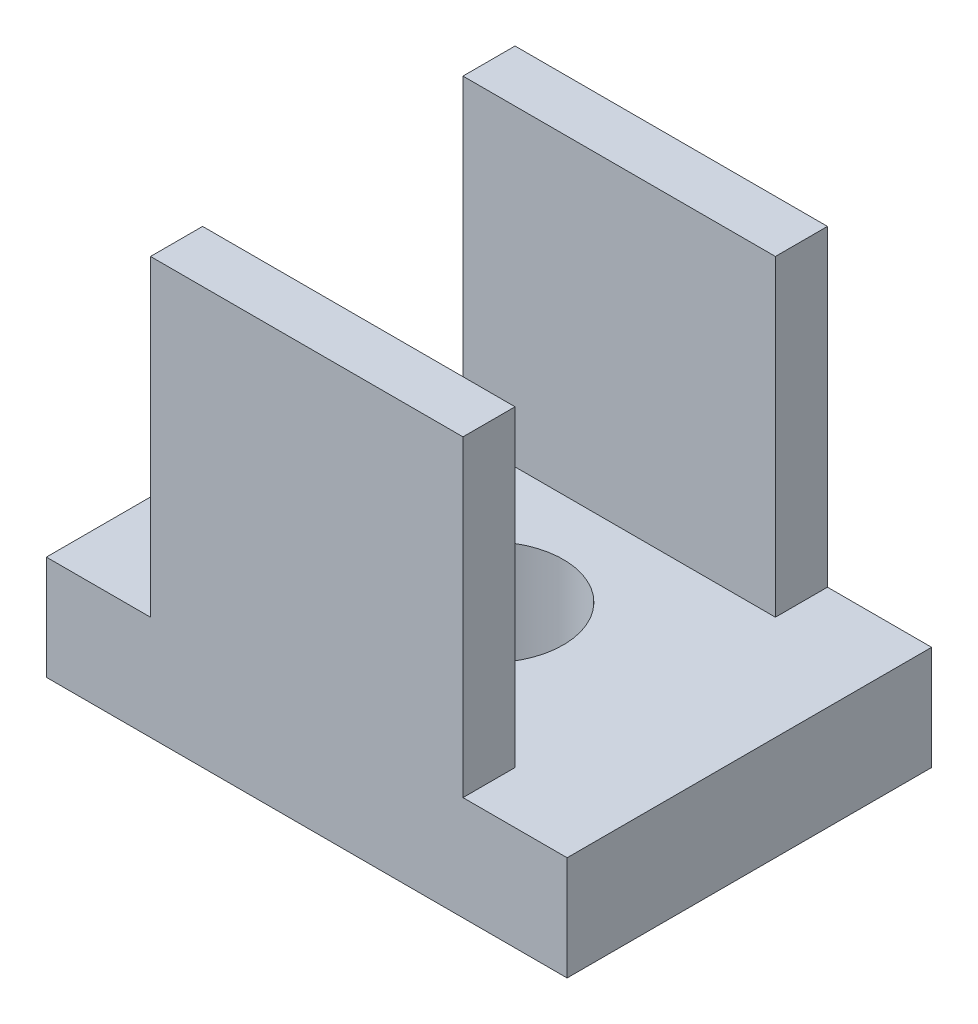
ISO-10303-21;
HEADER;
FILE_DESCRIPTION(('STEP AP214'),'2;1');
FILE_NAME('part.step','',(''),(''),'','','');
FILE_SCHEMA(('AUTOMOTIVE_DESIGN { 1 0 10303 214 1 1 1 1 }'));
ENDSEC;
DATA;
#1=APPLICATION_CONTEXT('core data for automotive mechanical design processes');
#2=APPLICATION_PROTOCOL_DEFINITION('international standard','automotive_design',2000,#1);
#3=PRODUCT_CONTEXT('',#1,'mechanical');
#4=PRODUCT('Part','Part','',(#3));
#5=PRODUCT_RELATED_PRODUCT_CATEGORY('part','',(#4));
#6=PRODUCT_DEFINITION_FORMATION('','',#4);
#7=PRODUCT_DEFINITION_CONTEXT('part definition',#1,'design');
#8=PRODUCT_DEFINITION('design','',#6,#7);
#9=PRODUCT_DEFINITION_SHAPE('','',#8);
#10=(LENGTH_UNIT() NAMED_UNIT(*) SI_UNIT(.MILLI.,.METRE.));
#11=(NAMED_UNIT(*) PLANE_ANGLE_UNIT() SI_UNIT($,.RADIAN.));
#12=(NAMED_UNIT(*) SI_UNIT($,.STERADIAN.) SOLID_ANGLE_UNIT());
#13=UNCERTAINTY_MEASURE_WITH_UNIT(LENGTH_MEASURE(1.E-05),#10,'distance_accuracy_value','');
#14=(GEOMETRIC_REPRESENTATION_CONTEXT(3) GLOBAL_UNCERTAINTY_ASSIGNED_CONTEXT((#13)) GLOBAL_UNIT_ASSIGNED_CONTEXT((#10,
#11,#12)) REPRESENTATION_CONTEXT('',''));
#15=CARTESIAN_POINT('',(0.,0.,0.));
#16=DIRECTION('',(0.,0.,1.));
#17=DIRECTION('',(1.,0.,0.));
#18=AXIS2_PLACEMENT_3D('',#15,#16,#17);
#19=CARTESIAN_POINT('',(0.,2.,0.));
#20=DIRECTION('',(0.,-1.,0.));
#21=DIRECTION('',(0.,0.,-1.));
#22=AXIS2_PLACEMENT_3D('',#19,#20,#21);
#23=PLANE('',#22);
#24=CARTESIAN_POINT('',(0.,2.,0.));
#25=DIRECTION('',(0.,1.,0.));
#26=DIRECTION('',(0.,0.,1.));
#27=AXIS2_PLACEMENT_3D('',#24,#25,#26);
#28=CIRCLE('',#27,1.425);
#29=CARTESIAN_POINT('',(0.,2.,1.425));
#30=VERTEX_POINT('',#29);
#31=EDGE_CURVE('E217',#30,#30,#28,.T.);
#32=ORIENTED_EDGE('',*,*,#31,.F.);
#33=EDGE_LOOP('',(#32));
#34=FACE_BOUND('',#33,.T.);
#35=DIRECTION('',(0.,0.,1.));
#36=VECTOR('',#35,1.);
#37=CARTESIAN_POINT('',(-3.,2.,2.5));
#38=LINE('',#37,#36);
#39=CARTESIAN_POINT('',(-3.,2.,2.5));
#40=VERTEX_POINT('',#39);
#41=CARTESIAN_POINT('',(-3.,2.,3.5));
#42=VERTEX_POINT('',#41);
#43=EDGE_CURVE('E72',#40,#42,#38,.T.);
#44=ORIENTED_EDGE('',*,*,#43,.F.);
#45=DIRECTION('',(-1.,0.,0.));
#46=VECTOR('',#45,1.);
#47=CARTESIAN_POINT('',(-3.,2.,2.5));
#48=LINE('',#47,#46);
#49=CARTESIAN_POINT('',(3.,2.,2.5));
#50=VERTEX_POINT('',#49);
#51=EDGE_CURVE('E76',#50,#40,#48,.T.);
#52=ORIENTED_EDGE('',*,*,#51,.F.);
#53=DIRECTION('',(0.,0.,-1.));
#54=VECTOR('',#53,1.);
#55=CARTESIAN_POINT('',(3.,2.,2.5));
#56=LINE('',#55,#54);
#57=CARTESIAN_POINT('',(3.,2.,3.5));
#58=VERTEX_POINT('',#57);
#59=EDGE_CURVE('E278',#58,#50,#56,.T.);
#60=ORIENTED_EDGE('',*,*,#59,.F.);
#61=DIRECTION('',(1.,0.,0.));
#62=VECTOR('',#61,1.);
#63=CARTESIAN_POINT('',(-5.,2.,3.5));
#64=LINE('',#63,#62);
#65=CARTESIAN_POINT('',(5.,2.,3.5));
#66=VERTEX_POINT('',#65);
#67=EDGE_CURVE('E239',#58,#66,#64,.T.);
#68=ORIENTED_EDGE('',*,*,#67,.T.);
#69=DIRECTION('',(0.,0.,-1.));
#70=VECTOR('',#69,1.);
#71=CARTESIAN_POINT('',(5.,2.,3.5));
#72=LINE('',#71,#70);
#73=CARTESIAN_POINT('',(5.,2.,-3.5));
#74=VERTEX_POINT('',#73);
#75=EDGE_CURVE('E235',#66,#74,#72,.T.);
#76=ORIENTED_EDGE('',*,*,#75,.T.);
#77=DIRECTION('',(1.,0.,0.));
#78=VECTOR('',#77,1.);
#79=CARTESIAN_POINT('',(-5.,2.,-3.5));
#80=LINE('',#79,#78);
#81=CARTESIAN_POINT('',(3.,2.,-3.5));
#82=VERTEX_POINT('',#81);
#83=EDGE_CURVE('E229',#82,#74,#80,.T.);
#84=ORIENTED_EDGE('',*,*,#83,.F.);
#85=DIRECTION('',(0.,0.,-1.));
#86=VECTOR('',#85,1.);
#87=CARTESIAN_POINT('',(3.,2.,-2.5));
#88=LINE('',#87,#86);
#89=CARTESIAN_POINT('',(3.,2.,-2.5));
#90=VERTEX_POINT('',#89);
#91=EDGE_CURVE('E185',#90,#82,#88,.T.);
#92=ORIENTED_EDGE('',*,*,#91,.F.);
#93=DIRECTION('',(1.,0.,0.));
#94=VECTOR('',#93,1.);
#95=CARTESIAN_POINT('',(-3.,2.,-2.5));
#96=LINE('',#95,#94);
#97=CARTESIAN_POINT('',(-3.,2.,-2.5));
#98=VERTEX_POINT('',#97);
#99=EDGE_CURVE('E174',#98,#90,#96,.T.);
#100=ORIENTED_EDGE('',*,*,#99,.F.);
#101=DIRECTION('',(0.,0.,1.));
#102=VECTOR('',#101,1.);
#103=CARTESIAN_POINT('',(-3.,2.,-2.5));
#104=LINE('',#103,#102);
#105=CARTESIAN_POINT('',(-3.,2.,-3.5));
#106=VERTEX_POINT('',#105);
#107=EDGE_CURVE('E169',#106,#98,#104,.T.);
#108=ORIENTED_EDGE('',*,*,#107,.F.);
#109=CARTESIAN_POINT('',(-5.,2.,-3.5));
#110=VERTEX_POINT('',#109);
#111=EDGE_CURVE('E231',#110,#106,#80,.T.);
#112=ORIENTED_EDGE('',*,*,#111,.F.);
#113=DIRECTION('',(0.,0.,-1.));
#114=VECTOR('',#113,1.);
#115=CARTESIAN_POINT('',(-5.,2.,3.5));
#116=LINE('',#115,#114);
#117=CARTESIAN_POINT('',(-5.,2.,3.5));
#118=VERTEX_POINT('',#117);
#119=EDGE_CURVE('E225',#118,#110,#116,.T.);
#120=ORIENTED_EDGE('',*,*,#119,.F.);
#121=EDGE_CURVE('E240',#118,#42,#64,.T.);
#122=ORIENTED_EDGE('',*,*,#121,.T.);
#123=EDGE_LOOP('',(#44,#52,#60,#68,#76,#84,#92,#100,#108,#112,#120,#122));
#124=FACE_BOUND('',#123,.T.);
#125=ADVANCED_FACE('F54',(#34,#124),#23,.F.);
#126=CARTESIAN_POINT('',(0.,0.,0.));
#127=DIRECTION('',(0.,-1.,0.));
#128=DIRECTION('',(0.,0.,-1.));
#129=AXIS2_PLACEMENT_3D('',#126,#127,#128);
#130=PLANE('',#129);
#131=DIRECTION('',(0.,0.,-1.));
#132=VECTOR('',#131,1.);
#133=CARTESIAN_POINT('',(-5.,0.,3.5));
#134=LINE('',#133,#132);
#135=CARTESIAN_POINT('',(-5.,0.,3.5));
#136=VERTEX_POINT('',#135);
#137=CARTESIAN_POINT('',(-5.,0.,-3.5));
#138=VERTEX_POINT('',#137);
#139=EDGE_CURVE('E221',#136,#138,#134,.T.);
#140=ORIENTED_EDGE('',*,*,#139,.T.);
#141=DIRECTION('',(1.,0.,0.));
#142=VECTOR('',#141,1.);
#143=CARTESIAN_POINT('',(-5.,0.,-3.5));
#144=LINE('',#143,#142);
#145=CARTESIAN_POINT('',(5.,0.,-3.5));
#146=VERTEX_POINT('',#145);
#147=EDGE_CURVE('E246',#138,#146,#144,.T.);
#148=ORIENTED_EDGE('',*,*,#147,.T.);
#149=DIRECTION('',(0.,0.,-1.));
#150=VECTOR('',#149,1.);
#151=CARTESIAN_POINT('',(5.,0.,3.5));
#152=LINE('',#151,#150);
#153=CARTESIAN_POINT('',(5.,0.,3.5));
#154=VERTEX_POINT('',#153);
#155=EDGE_CURVE('E250',#154,#146,#152,.T.);
#156=ORIENTED_EDGE('',*,*,#155,.F.);
#157=DIRECTION('',(1.,0.,0.));
#158=VECTOR('',#157,1.);
#159=CARTESIAN_POINT('',(-5.,0.,3.5));
#160=LINE('',#159,#158);
#161=EDGE_CURVE('E230',#136,#154,#160,.T.);
#162=ORIENTED_EDGE('',*,*,#161,.F.);
#163=EDGE_LOOP('',(#140,#148,#156,#162));
#164=FACE_BOUND('',#163,.T.);
#165=CARTESIAN_POINT('',(0.,0.,0.));
#166=DIRECTION('',(0.,1.,0.));
#167=DIRECTION('',(0.,0.,1.));
#168=AXIS2_PLACEMENT_3D('',#165,#166,#167);
#169=CIRCLE('',#168,1.425);
#170=CARTESIAN_POINT('',(0.,0.,1.425));
#171=VERTEX_POINT('',#170);
#172=EDGE_CURVE('E216',#171,#171,#169,.T.);
#173=ORIENTED_EDGE('',*,*,#172,.T.);
#174=EDGE_LOOP('',(#173));
#175=FACE_BOUND('',#174,.T.);
#176=ADVANCED_FACE('F272',(#164,#175),#130,.T.);
#177=CARTESIAN_POINT('',(-5.,2.,3.5));
#178=DIRECTION('',(-1.,0.,0.));
#179=DIRECTION('',(0.,0.,1.));
#180=AXIS2_PLACEMENT_3D('',#177,#178,#179);
#181=PLANE('',#180);
#182=ORIENTED_EDGE('',*,*,#139,.F.);
#183=DIRECTION('',(0.,-1.,0.));
#184=VECTOR('',#183,1.);
#185=CARTESIAN_POINT('',(-5.,2.,3.5));
#186=LINE('',#185,#184);
#187=EDGE_CURVE('E12',#118,#136,#186,.T.);
#188=ORIENTED_EDGE('',*,*,#187,.F.);
#189=ORIENTED_EDGE('',*,*,#119,.T.);
#190=DIRECTION('',(0.,-1.,0.));
#191=VECTOR('',#190,1.);
#192=CARTESIAN_POINT('',(-5.,2.,-3.5));
#193=LINE('',#192,#191);
#194=EDGE_CURVE('E58',#110,#138,#193,.T.);
#195=ORIENTED_EDGE('',*,*,#194,.T.);
#196=EDGE_LOOP('',(#182,#188,#189,#195));
#197=FACE_BOUND('',#196,.T.);
#198=ADVANCED_FACE('F56',(#197),#181,.T.);
#199=CARTESIAN_POINT('',(-5.,2.,3.5));
#200=DIRECTION('',(0.,0.,-1.));
#201=DIRECTION('',(-1.,0.,0.));
#202=AXIS2_PLACEMENT_3D('',#199,#200,#201);
#203=PLANE('',#202);
#204=ORIENTED_EDGE('',*,*,#161,.T.);
#205=DIRECTION('',(0.,-1.,0.));
#206=VECTOR('',#205,1.);
#207=CARTESIAN_POINT('',(5.,2.,3.5));
#208=LINE('',#207,#206);
#209=EDGE_CURVE('E64',#66,#154,#208,.T.);
#210=ORIENTED_EDGE('',*,*,#209,.F.);
#211=ORIENTED_EDGE('',*,*,#67,.F.);
#212=DIRECTION('',(0.,-1.,0.));
#213=VECTOR('',#212,1.);
#214=CARTESIAN_POINT('',(3.,8.,3.5));
#215=LINE('',#214,#213);
#216=CARTESIAN_POINT('',(3.,8.,3.5));
#217=VERTEX_POINT('',#216);
#218=EDGE_CURVE('E151',#217,#58,#215,.T.);
#219=ORIENTED_EDGE('',*,*,#218,.F.);
#220=DIRECTION('',(1.,0.,0.));
#221=VECTOR('',#220,1.);
#222=CARTESIAN_POINT('',(-3.,8.,3.5));
#223=LINE('',#222,#221);
#224=CARTESIAN_POINT('',(-3.,8.,3.5));
#225=VERTEX_POINT('',#224);
#226=EDGE_CURVE('E144',#225,#217,#223,.T.);
#227=ORIENTED_EDGE('',*,*,#226,.F.);
#228=DIRECTION('',(0.,-1.,0.));
#229=VECTOR('',#228,1.);
#230=CARTESIAN_POINT('',(-3.,8.,3.5));
#231=LINE('',#230,#229);
#232=EDGE_CURVE('E149',#225,#42,#231,.T.);
#233=ORIENTED_EDGE('',*,*,#232,.T.);
#234=ORIENTED_EDGE('',*,*,#121,.F.);
#235=ORIENTED_EDGE('',*,*,#187,.T.);
#236=EDGE_LOOP('',(#204,#210,#211,#219,#227,#233,#234,#235));
#237=FACE_BOUND('',#236,.T.);
#238=ADVANCED_FACE('F146',(#237),#203,.F.);
#239=CARTESIAN_POINT('',(5.,2.,3.5));
#240=DIRECTION('',(-1.,0.,0.));
#241=DIRECTION('',(0.,0.,1.));
#242=AXIS2_PLACEMENT_3D('',#239,#240,#241);
#243=PLANE('',#242);
#244=ORIENTED_EDGE('',*,*,#155,.T.);
#245=DIRECTION('',(0.,-1.,0.));
#246=VECTOR('',#245,1.);
#247=CARTESIAN_POINT('',(5.,2.,-3.5));
#248=LINE('',#247,#246);
#249=EDGE_CURVE('E258',#74,#146,#248,.T.);
#250=ORIENTED_EDGE('',*,*,#249,.F.);
#251=ORIENTED_EDGE('',*,*,#75,.F.);
#252=ORIENTED_EDGE('',*,*,#209,.T.);
#253=EDGE_LOOP('',(#244,#250,#251,#252));
#254=FACE_BOUND('',#253,.T.);
#255=ADVANCED_FACE('F277',(#254),#243,.F.);
#256=CARTESIAN_POINT('',(-5.,2.,-3.5));
#257=DIRECTION('',(0.,0.,-1.));
#258=DIRECTION('',(-1.,0.,0.));
#259=AXIS2_PLACEMENT_3D('',#256,#257,#258);
#260=PLANE('',#259);
#261=ORIENTED_EDGE('',*,*,#147,.F.);
#262=ORIENTED_EDGE('',*,*,#194,.F.);
#263=ORIENTED_EDGE('',*,*,#111,.T.);
#264=DIRECTION('',(0.,-1.,0.));
#265=VECTOR('',#264,1.);
#266=CARTESIAN_POINT('',(-3.,8.,-3.5));
#267=LINE('',#266,#265);
#268=CARTESIAN_POINT('',(-3.,8.,-3.5));
#269=VERTEX_POINT('',#268);
#270=EDGE_CURVE('E193',#269,#106,#267,.T.);
#271=ORIENTED_EDGE('',*,*,#270,.F.);
#272=DIRECTION('',(-1.,0.,0.));
#273=VECTOR('',#272,1.);
#274=CARTESIAN_POINT('',(-3.,8.,-3.5));
#275=LINE('',#274,#273);
#276=CARTESIAN_POINT('',(3.,8.,-3.5));
#277=VERTEX_POINT('',#276);
#278=EDGE_CURVE('E191',#277,#269,#275,.T.);
#279=ORIENTED_EDGE('',*,*,#278,.F.);
#280=DIRECTION('',(0.,-1.,0.));
#281=VECTOR('',#280,1.);
#282=CARTESIAN_POINT('',(3.,8.,-3.5));
#283=LINE('',#282,#281);
#284=EDGE_CURVE('E204',#277,#82,#283,.T.);
#285=ORIENTED_EDGE('',*,*,#284,.T.);
#286=ORIENTED_EDGE('',*,*,#83,.T.);
#287=ORIENTED_EDGE('',*,*,#249,.T.);
#288=EDGE_LOOP('',(#261,#262,#263,#271,#279,#285,#286,#287));
#289=FACE_BOUND('',#288,.T.);
#290=ADVANCED_FACE('F268',(#289),#260,.T.);
#291=CARTESIAN_POINT('',(0.,2.,0.));
#292=DIRECTION('',(0.,-1.,0.));
#293=DIRECTION('',(0.,0.,-1.));
#294=AXIS2_PLACEMENT_3D('',#291,#292,#293);
#295=CYLINDRICAL_SURFACE('',#294,1.425);
#296=ORIENTED_EDGE('',*,*,#31,.T.);
#297=EDGE_LOOP('',(#296));
#298=FACE_BOUND('',#297,.T.);
#299=ORIENTED_EDGE('',*,*,#172,.F.);
#300=EDGE_LOOP('',(#299));
#301=FACE_BOUND('',#300,.T.);
#302=ADVANCED_FACE('F314',(#298,#301),#295,.F.);
#303=CARTESIAN_POINT('',(-3.,8.,-2.5));
#304=DIRECTION('',(1.,0.,0.));
#305=DIRECTION('',(0.,0.,-1.));
#306=AXIS2_PLACEMENT_3D('',#303,#304,#305);
#307=PLANE('',#306);
#308=ORIENTED_EDGE('',*,*,#107,.T.);
#309=DIRECTION('',(0.,-1.,0.));
#310=VECTOR('',#309,1.);
#311=CARTESIAN_POINT('',(-3.,8.,-2.5));
#312=LINE('',#311,#310);
#313=CARTESIAN_POINT('',(-3.,8.,-2.5));
#314=VERTEX_POINT('',#313);
#315=EDGE_CURVE('E212',#314,#98,#312,.T.);
#316=ORIENTED_EDGE('',*,*,#315,.F.);
#317=DIRECTION('',(0.,0.,1.));
#318=VECTOR('',#317,1.);
#319=CARTESIAN_POINT('',(-3.,8.,-2.5));
#320=LINE('',#319,#318);
#321=EDGE_CURVE('E180',#269,#314,#320,.T.);
#322=ORIENTED_EDGE('',*,*,#321,.F.);
#323=ORIENTED_EDGE('',*,*,#270,.T.);
#324=EDGE_LOOP('',(#308,#316,#322,#323));
#325=FACE_BOUND('',#324,.T.);
#326=ADVANCED_FACE('F293',(#325),#307,.F.);
#327=CARTESIAN_POINT('',(-3.,8.,-2.5));
#328=DIRECTION('',(0.,0.,-1.));
#329=DIRECTION('',(-1.,0.,0.));
#330=AXIS2_PLACEMENT_3D('',#327,#328,#329);
#331=PLANE('',#330);
#332=ORIENTED_EDGE('',*,*,#99,.T.);
#333=DIRECTION('',(0.,-1.,0.));
#334=VECTOR('',#333,1.);
#335=CARTESIAN_POINT('',(3.,8.,-2.5));
#336=LINE('',#335,#334);
#337=CARTESIAN_POINT('',(3.,8.,-2.5));
#338=VERTEX_POINT('',#337);
#339=EDGE_CURVE('E208',#338,#90,#336,.T.);
#340=ORIENTED_EDGE('',*,*,#339,.F.);
#341=DIRECTION('',(1.,0.,0.));
#342=VECTOR('',#341,1.);
#343=CARTESIAN_POINT('',(-3.,8.,-2.5));
#344=LINE('',#343,#342);
#345=EDGE_CURVE('E184',#314,#338,#344,.T.);
#346=ORIENTED_EDGE('',*,*,#345,.F.);
#347=ORIENTED_EDGE('',*,*,#315,.T.);
#348=EDGE_LOOP('',(#332,#340,#346,#347));
#349=FACE_BOUND('',#348,.T.);
#350=ADVANCED_FACE('F289',(#349),#331,.F.);
#351=CARTESIAN_POINT('',(3.,8.,-2.5));
#352=DIRECTION('',(-1.,0.,0.));
#353=DIRECTION('',(0.,0.,1.));
#354=AXIS2_PLACEMENT_3D('',#351,#352,#353);
#355=PLANE('',#354);
#356=ORIENTED_EDGE('',*,*,#91,.T.);
#357=ORIENTED_EDGE('',*,*,#284,.F.);
#358=DIRECTION('',(0.,0.,-1.));
#359=VECTOR('',#358,1.);
#360=CARTESIAN_POINT('',(3.,8.,-2.5));
#361=LINE('',#360,#359);
#362=EDGE_CURVE('E188',#338,#277,#361,.T.);
#363=ORIENTED_EDGE('',*,*,#362,.F.);
#364=ORIENTED_EDGE('',*,*,#339,.T.);
#365=EDGE_LOOP('',(#356,#357,#363,#364));
#366=FACE_BOUND('',#365,.T.);
#367=ADVANCED_FACE('F286',(#366),#355,.F.);
#368=CARTESIAN_POINT('',(0.,8.,0.));
#369=DIRECTION('',(0.,-1.,0.));
#370=DIRECTION('',(0.,0.,-1.));
#371=AXIS2_PLACEMENT_3D('',#368,#369,#370);
#372=PLANE('',#371);
#373=ORIENTED_EDGE('',*,*,#321,.T.);
#374=ORIENTED_EDGE('',*,*,#345,.T.);
#375=ORIENTED_EDGE('',*,*,#362,.T.);
#376=ORIENTED_EDGE('',*,*,#278,.T.);
#377=EDGE_LOOP('',(#373,#374,#375,#376));
#378=FACE_BOUND('',#377,.T.);
#379=ADVANCED_FACE('F295',(#378),#372,.F.);
#380=CARTESIAN_POINT('',(-3.,8.,2.5));
#381=DIRECTION('',(1.,0.,0.));
#382=DIRECTION('',(0.,0.,-1.));
#383=AXIS2_PLACEMENT_3D('',#380,#381,#382);
#384=PLANE('',#383);
#385=ORIENTED_EDGE('',*,*,#43,.T.);
#386=ORIENTED_EDGE('',*,*,#232,.F.);
#387=DIRECTION('',(0.,0.,1.));
#388=VECTOR('',#387,1.);
#389=CARTESIAN_POINT('',(-3.,8.,2.5));
#390=LINE('',#389,#388);
#391=CARTESIAN_POINT('',(-3.,8.,2.5));
#392=VERTEX_POINT('',#391);
#393=EDGE_CURVE('E156',#392,#225,#390,.T.);
#394=ORIENTED_EDGE('',*,*,#393,.F.);
#395=DIRECTION('',(0.,-1.,0.));
#396=VECTOR('',#395,1.);
#397=CARTESIAN_POINT('',(-3.,8.,2.5));
#398=LINE('',#397,#396);
#399=EDGE_CURVE('E382',#392,#40,#398,.T.);
#400=ORIENTED_EDGE('',*,*,#399,.T.);
#401=EDGE_LOOP('',(#385,#386,#394,#400));
#402=FACE_BOUND('',#401,.T.);
#403=ADVANCED_FACE('F167',(#402),#384,.F.);
#404=CARTESIAN_POINT('',(3.,8.,2.5));
#405=DIRECTION('',(-1.,0.,0.));
#406=DIRECTION('',(0.,0.,1.));
#407=AXIS2_PLACEMENT_3D('',#404,#405,#406);
#408=PLANE('',#407);
#409=ORIENTED_EDGE('',*,*,#59,.T.);
#410=DIRECTION('',(0.,-1.,0.));
#411=VECTOR('',#410,1.);
#412=CARTESIAN_POINT('',(3.,8.,2.5));
#413=LINE('',#412,#411);
#414=CARTESIAN_POINT('',(3.,8.,2.5));
#415=VERTEX_POINT('',#414);
#416=EDGE_CURVE('E176',#415,#50,#413,.T.);
#417=ORIENTED_EDGE('',*,*,#416,.F.);
#418=DIRECTION('',(0.,0.,-1.));
#419=VECTOR('',#418,1.);
#420=CARTESIAN_POINT('',(3.,8.,2.5));
#421=LINE('',#420,#419);
#422=EDGE_CURVE('E155',#217,#415,#421,.T.);
#423=ORIENTED_EDGE('',*,*,#422,.F.);
#424=ORIENTED_EDGE('',*,*,#218,.T.);
#425=EDGE_LOOP('',(#409,#417,#423,#424));
#426=FACE_BOUND('',#425,.T.);
#427=ADVANCED_FACE('F302',(#426),#408,.F.);
#428=CARTESIAN_POINT('',(-3.,8.,2.5));
#429=DIRECTION('',(0.,0.,1.));
#430=DIRECTION('',(1.,0.,0.));
#431=AXIS2_PLACEMENT_3D('',#428,#429,#430);
#432=PLANE('',#431);
#433=ORIENTED_EDGE('',*,*,#51,.T.);
#434=ORIENTED_EDGE('',*,*,#399,.F.);
#435=DIRECTION('',(-1.,0.,0.));
#436=VECTOR('',#435,1.);
#437=CARTESIAN_POINT('',(-3.,8.,2.5));
#438=LINE('',#437,#436);
#439=EDGE_CURVE('E161',#415,#392,#438,.T.);
#440=ORIENTED_EDGE('',*,*,#439,.F.);
#441=ORIENTED_EDGE('',*,*,#416,.T.);
#442=EDGE_LOOP('',(#433,#434,#440,#441));
#443=FACE_BOUND('',#442,.T.);
#444=ADVANCED_FACE('F359',(#443),#432,.F.);
#445=CARTESIAN_POINT('',(0.,8.,0.));
#446=DIRECTION('',(0.,1.,0.));
#447=DIRECTION('',(0.,0.,1.));
#448=AXIS2_PLACEMENT_3D('',#445,#446,#447);
#449=PLANE('',#448);
#450=ORIENTED_EDGE('',*,*,#393,.T.);
#451=ORIENTED_EDGE('',*,*,#226,.T.);
#452=ORIENTED_EDGE('',*,*,#422,.T.);
#453=ORIENTED_EDGE('',*,*,#439,.T.);
#454=EDGE_LOOP('',(#450,#451,#452,#453));
#455=FACE_BOUND('',#454,.T.);
#456=ADVANCED_FACE('F159',(#455),#449,.T.);
#457=CLOSED_SHELL('',(#125,#176,#198,#238,#255,#290,#302,#326,#350,#367,#379,#403,#427,#444,#456));
#458=MANIFOLD_SOLID_BREP('B2',#457);
#459=ADVANCED_BREP_SHAPE_REPRESENTATION('',(#18,#458),#14);
#460=SHAPE_DEFINITION_REPRESENTATION(#9,#459);
ENDSEC;
END-ISO-10303-21;
